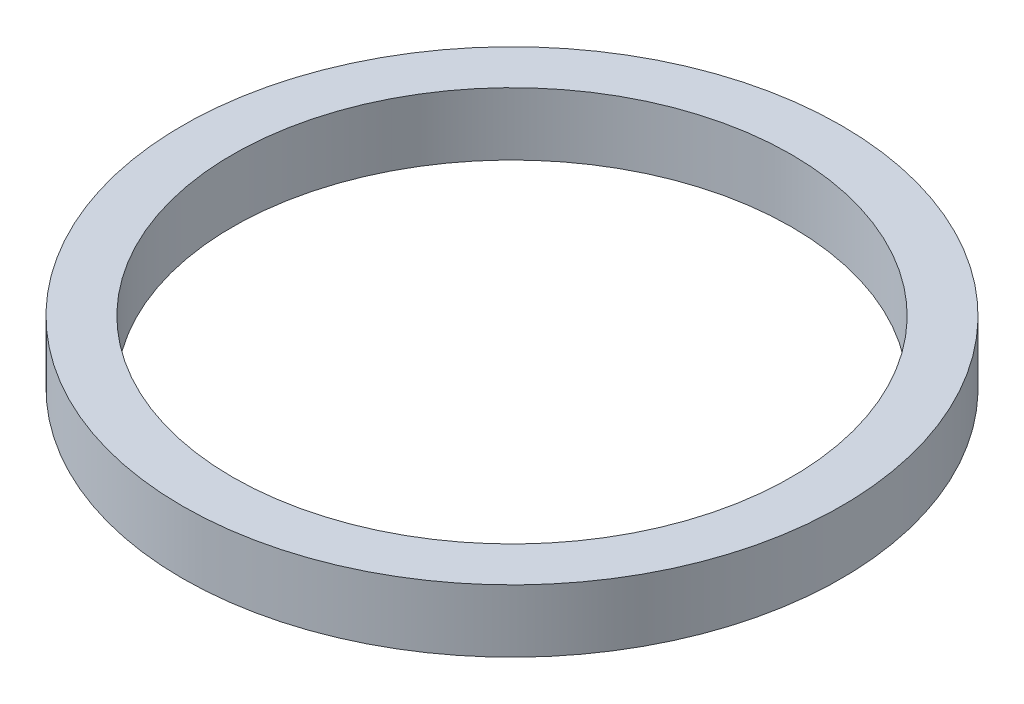
ISO-10303-21;
HEADER;
FILE_DESCRIPTION(('STEP AP214'),'2;1');
FILE_NAME('part.step','',(''),(''),'','','');
FILE_SCHEMA(('AUTOMOTIVE_DESIGN { 1 0 10303 214 1 1 1 1 }'));
ENDSEC;
DATA;
#1=APPLICATION_CONTEXT('core data for automotive mechanical design processes');
#2=APPLICATION_PROTOCOL_DEFINITION('international standard','automotive_design',2000,#1);
#3=PRODUCT_CONTEXT('',#1,'mechanical');
#4=PRODUCT('Part','Part','',(#3));
#5=PRODUCT_RELATED_PRODUCT_CATEGORY('part','',(#4));
#6=PRODUCT_DEFINITION_FORMATION('','',#4);
#7=PRODUCT_DEFINITION_CONTEXT('part definition',#1,'design');
#8=PRODUCT_DEFINITION('design','',#6,#7);
#9=PRODUCT_DEFINITION_SHAPE('','',#8);
#10=(LENGTH_UNIT() NAMED_UNIT(*) SI_UNIT(.MILLI.,.METRE.));
#11=(NAMED_UNIT(*) PLANE_ANGLE_UNIT() SI_UNIT($,.RADIAN.));
#12=(NAMED_UNIT(*) SI_UNIT($,.STERADIAN.) SOLID_ANGLE_UNIT());
#13=UNCERTAINTY_MEASURE_WITH_UNIT(LENGTH_MEASURE(1.E-05),#10,'distance_accuracy_value','');
#14=(GEOMETRIC_REPRESENTATION_CONTEXT(3) GLOBAL_UNCERTAINTY_ASSIGNED_CONTEXT((#13)) GLOBAL_UNIT_ASSIGNED_CONTEXT((#10,
#11,#12)) REPRESENTATION_CONTEXT('',''));
#15=CARTESIAN_POINT('',(0.,0.,0.));
#16=DIRECTION('',(0.,0.,1.));
#17=DIRECTION('',(1.,0.,0.));
#18=AXIS2_PLACEMENT_3D('',#15,#16,#17);
#19=CARTESIAN_POINT('',(0.,0.,0.));
#20=DIRECTION('',(0.,-1.,0.));
#21=DIRECTION('',(0.,0.,-1.));
#22=AXIS2_PLACEMENT_3D('',#19,#20,#21);
#23=CYLINDRICAL_SURFACE('',#22,16.7005);
#24=CARTESIAN_POINT('',(0.,-1.5875,0.));
#25=DIRECTION('',(0.,-1.,0.));
#26=DIRECTION('',(0.,0.,-1.));
#27=AXIS2_PLACEMENT_3D('',#24,#25,#26);
#28=CIRCLE('',#27,16.7005);
#29=CARTESIAN_POINT('',(0.,-1.5875,-16.7005));
#30=VERTEX_POINT('',#29);
#31=EDGE_CURVE('E10',#30,#30,#28,.T.);
#32=ORIENTED_EDGE('',*,*,#31,.F.);
#33=EDGE_LOOP('',(#32));
#34=FACE_BOUND('',#33,.T.);
#35=CARTESIAN_POINT('',(0.,1.5875,0.));
#36=DIRECTION('',(0.,-1.,0.));
#37=DIRECTION('',(0.,0.,-1.));
#38=AXIS2_PLACEMENT_3D('',#35,#36,#37);
#39=CIRCLE('',#38,16.7005);
#40=CARTESIAN_POINT('',(0.,1.5875,-16.7005));
#41=VERTEX_POINT('',#40);
#42=EDGE_CURVE('E46',#41,#41,#39,.T.);
#43=ORIENTED_EDGE('',*,*,#42,.T.);
#44=EDGE_LOOP('',(#43));
#45=FACE_BOUND('',#44,.T.);
#46=ADVANCED_FACE('F32',(#34,#45),#23,.T.);
#47=CARTESIAN_POINT('',(-16.7005,-1.5875,0.));
#48=DIRECTION('',(0.,1.,0.));
#49=DIRECTION('',(0.,0.,1.));
#50=AXIS2_PLACEMENT_3D('',#47,#48,#49);
#51=PLANE('',#50);
#52=CARTESIAN_POINT('',(0.,-1.5875,0.));
#53=DIRECTION('',(0.,-1.,0.));
#54=DIRECTION('',(0.,0.,-1.));
#55=AXIS2_PLACEMENT_3D('',#52,#53,#54);
#56=CIRCLE('',#55,14.1605);
#57=CARTESIAN_POINT('',(0.,-1.5875,-14.1605));
#58=VERTEX_POINT('',#57);
#59=EDGE_CURVE('E38',#58,#58,#56,.T.);
#60=ORIENTED_EDGE('',*,*,#59,.F.);
#61=EDGE_LOOP('',(#60));
#62=FACE_BOUND('',#61,.T.);
#63=ORIENTED_EDGE('',*,*,#31,.T.);
#64=EDGE_LOOP('',(#63));
#65=FACE_BOUND('',#64,.T.);
#66=ADVANCED_FACE('F61',(#62,#65),#51,.F.);
#67=CARTESIAN_POINT('',(0.,0.,0.));
#68=DIRECTION('',(0.,-1.,0.));
#69=DIRECTION('',(0.,0.,-1.));
#70=AXIS2_PLACEMENT_3D('',#67,#68,#69);
#71=CYLINDRICAL_SURFACE('',#70,14.1605);
#72=CARTESIAN_POINT('',(0.,1.5875,0.));
#73=DIRECTION('',(0.,-1.,0.));
#74=DIRECTION('',(0.,0.,-1.));
#75=AXIS2_PLACEMENT_3D('',#72,#73,#74);
#76=CIRCLE('',#75,14.1605);
#77=CARTESIAN_POINT('',(0.,1.5875,-14.1605));
#78=VERTEX_POINT('',#77);
#79=EDGE_CURVE('E42',#78,#78,#76,.T.);
#80=ORIENTED_EDGE('',*,*,#79,.F.);
#81=EDGE_LOOP('',(#80));
#82=FACE_BOUND('',#81,.T.);
#83=ORIENTED_EDGE('',*,*,#59,.T.);
#84=EDGE_LOOP('',(#83));
#85=FACE_BOUND('',#84,.T.);
#86=ADVANCED_FACE('F56',(#82,#85),#71,.F.);
#87=CARTESIAN_POINT('',(-16.7005,1.5875,0.));
#88=DIRECTION('',(0.,-1.,0.));
#89=DIRECTION('',(0.,0.,-1.));
#90=AXIS2_PLACEMENT_3D('',#87,#88,#89);
#91=PLANE('',#90);
#92=ORIENTED_EDGE('',*,*,#42,.F.);
#93=EDGE_LOOP('',(#92));
#94=FACE_BOUND('',#93,.T.);
#95=ORIENTED_EDGE('',*,*,#79,.T.);
#96=EDGE_LOOP('',(#95));
#97=FACE_BOUND('',#96,.T.);
#98=ADVANCED_FACE('F53',(#94,#97),#91,.F.);
#99=CLOSED_SHELL('',(#46,#66,#86,#98));
#100=MANIFOLD_SOLID_BREP('B2',#99);
#101=ADVANCED_BREP_SHAPE_REPRESENTATION('',(#18,#100),#14);
#102=SHAPE_DEFINITION_REPRESENTATION(#9,#101);
ENDSEC;
END-ISO-10303-21;
